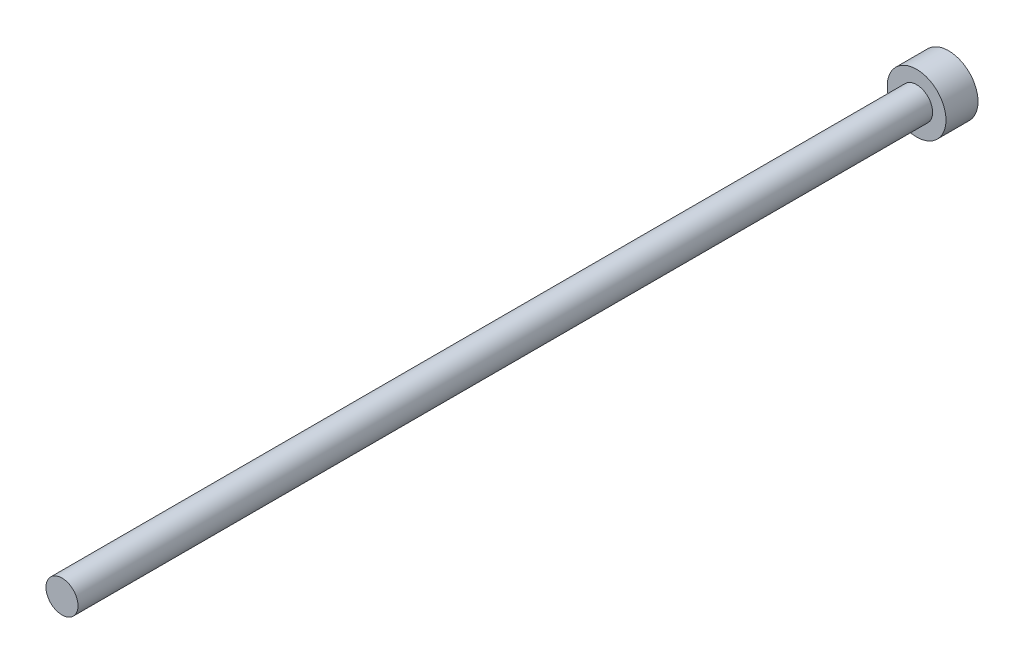
ISO-10303-21;
HEADER;
FILE_DESCRIPTION(('STEP AP214'),'2;1');
FILE_NAME('part.step','',(''),(''),'','','');
FILE_SCHEMA(('AUTOMOTIVE_DESIGN { 1 0 10303 214 1 1 1 1 }'));
ENDSEC;
DATA;
#1=APPLICATION_CONTEXT('core data for automotive mechanical design processes');
#2=APPLICATION_PROTOCOL_DEFINITION('international standard','automotive_design',2000,#1);
#3=PRODUCT_CONTEXT('',#1,'mechanical');
#4=PRODUCT('Part','Part','',(#3));
#5=PRODUCT_RELATED_PRODUCT_CATEGORY('part','',(#4));
#6=PRODUCT_DEFINITION_FORMATION('','',#4);
#7=PRODUCT_DEFINITION_CONTEXT('part definition',#1,'design');
#8=PRODUCT_DEFINITION('design','',#6,#7);
#9=PRODUCT_DEFINITION_SHAPE('','',#8);
#10=(LENGTH_UNIT() NAMED_UNIT(*) SI_UNIT(.MILLI.,.METRE.));
#11=(NAMED_UNIT(*) PLANE_ANGLE_UNIT() SI_UNIT($,.RADIAN.));
#12=(NAMED_UNIT(*) SI_UNIT($,.STERADIAN.) SOLID_ANGLE_UNIT());
#13=UNCERTAINTY_MEASURE_WITH_UNIT(LENGTH_MEASURE(1.E-05),#10,'distance_accuracy_value','');
#14=(GEOMETRIC_REPRESENTATION_CONTEXT(3) GLOBAL_UNCERTAINTY_ASSIGNED_CONTEXT((#13)) GLOBAL_UNIT_ASSIGNED_CONTEXT((#10,
#11,#12)) REPRESENTATION_CONTEXT('',''));
#15=CARTESIAN_POINT('',(0.,0.,0.));
#16=DIRECTION('',(0.,0.,1.));
#17=DIRECTION('',(1.,0.,0.));
#18=AXIS2_PLACEMENT_3D('',#15,#16,#17);
#19=CARTESIAN_POINT('',(0.,0.,1.5));
#20=DIRECTION('',(0.,0.,-1.));
#21=DIRECTION('',(-1.,0.,0.));
#22=AXIS2_PLACEMENT_3D('',#19,#20,#21);
#23=CYLINDRICAL_SURFACE('',#22,2.75);
#24=CARTESIAN_POINT('',(0.,0.,1.5));
#25=DIRECTION('',(0.,0.,1.));
#26=DIRECTION('',(1.,0.,0.));
#27=AXIS2_PLACEMENT_3D('',#24,#25,#26);
#28=CIRCLE('',#27,2.75);
#29=CARTESIAN_POINT('',(2.75,0.,1.5));
#30=VERTEX_POINT('',#29);
#31=EDGE_CURVE('E52',#30,#30,#28,.T.);
#32=ORIENTED_EDGE('',*,*,#31,.F.);
#33=EDGE_LOOP('',(#32));
#34=FACE_BOUND('',#33,.T.);
#35=CARTESIAN_POINT('',(0.,0.,-1.5));
#36=DIRECTION('',(0.,0.,1.));
#37=DIRECTION('',(1.,0.,0.));
#38=AXIS2_PLACEMENT_3D('',#35,#36,#37);
#39=CIRCLE('',#38,2.75);
#40=CARTESIAN_POINT('',(2.75,0.,-1.5));
#41=VERTEX_POINT('',#40);
#42=EDGE_CURVE('E47',#41,#41,#39,.T.);
#43=ORIENTED_EDGE('',*,*,#42,.T.);
#44=EDGE_LOOP('',(#43));
#45=FACE_BOUND('',#44,.T.);
#46=ADVANCED_FACE('F44',(#34,#45),#23,.T.);
#47=CARTESIAN_POINT('',(0.,0.,1.5));
#48=DIRECTION('',(0.,0.,1.));
#49=DIRECTION('',(1.,0.,0.));
#50=AXIS2_PLACEMENT_3D('',#47,#48,#49);
#51=PLANE('',#50);
#52=CARTESIAN_POINT('',(0.,0.,1.5));
#53=DIRECTION('',(0.,0.,1.));
#54=DIRECTION('',(1.,0.,0.));
#55=AXIS2_PLACEMENT_3D('',#52,#53,#54);
#56=CIRCLE('',#55,1.5);
#57=CARTESIAN_POINT('',(1.5,0.,1.5));
#58=VERTEX_POINT('',#57);
#59=EDGE_CURVE('E10',#58,#58,#56,.T.);
#60=ORIENTED_EDGE('',*,*,#59,.F.);
#61=EDGE_LOOP('',(#60));
#62=FACE_BOUND('',#61,.T.);
#63=ORIENTED_EDGE('',*,*,#31,.T.);
#64=EDGE_LOOP('',(#63));
#65=FACE_BOUND('',#64,.T.);
#66=ADVANCED_FACE('F67',(#62,#65),#51,.T.);
#67=CARTESIAN_POINT('',(0.,0.,-1.5));
#68=DIRECTION('',(0.,0.,1.));
#69=DIRECTION('',(1.,0.,0.));
#70=AXIS2_PLACEMENT_3D('',#67,#68,#69);
#71=PLANE('',#70);
#72=ORIENTED_EDGE('',*,*,#42,.F.);
#73=EDGE_LOOP('',(#72));
#74=FACE_BOUND('',#73,.T.);
#75=ADVANCED_FACE('F66',(#74),#71,.F.);
#76=CARTESIAN_POINT('',(0.,0.,81.5));
#77=DIRECTION('',(0.,0.,-1.));
#78=DIRECTION('',(-1.,0.,0.));
#79=AXIS2_PLACEMENT_3D('',#76,#77,#78);
#80=CYLINDRICAL_SURFACE('',#79,1.5);
#81=CARTESIAN_POINT('',(0.,0.,81.5));
#82=DIRECTION('',(0.,0.,1.));
#83=DIRECTION('',(1.,0.,0.));
#84=AXIS2_PLACEMENT_3D('',#81,#82,#83);
#85=CIRCLE('',#84,1.5);
#86=CARTESIAN_POINT('',(1.5,0.,81.5));
#87=VERTEX_POINT('',#86);
#88=EDGE_CURVE('E56',#87,#87,#85,.T.);
#89=ORIENTED_EDGE('',*,*,#88,.F.);
#90=EDGE_LOOP('',(#89));
#91=FACE_BOUND('',#90,.T.);
#92=ORIENTED_EDGE('',*,*,#59,.T.);
#93=EDGE_LOOP('',(#92));
#94=FACE_BOUND('',#93,.T.);
#95=ADVANCED_FACE('F68',(#91,#94),#80,.T.);
#96=CARTESIAN_POINT('',(0.,0.,81.5));
#97=DIRECTION('',(0.,0.,1.));
#98=DIRECTION('',(1.,0.,0.));
#99=AXIS2_PLACEMENT_3D('',#96,#97,#98);
#100=PLANE('',#99);
#101=ORIENTED_EDGE('',*,*,#88,.T.);
#102=EDGE_LOOP('',(#101));
#103=FACE_BOUND('',#102,.T.);
#104=ADVANCED_FACE('F72',(#103),#100,.T.);
#105=CLOSED_SHELL('',(#46,#66,#75,#95,#104));
#106=MANIFOLD_SOLID_BREP('B2',#105);
#107=ADVANCED_BREP_SHAPE_REPRESENTATION('',(#18,#106),#14);
#108=SHAPE_DEFINITION_REPRESENTATION(#9,#107);
ENDSEC;
END-ISO-10303-21;
